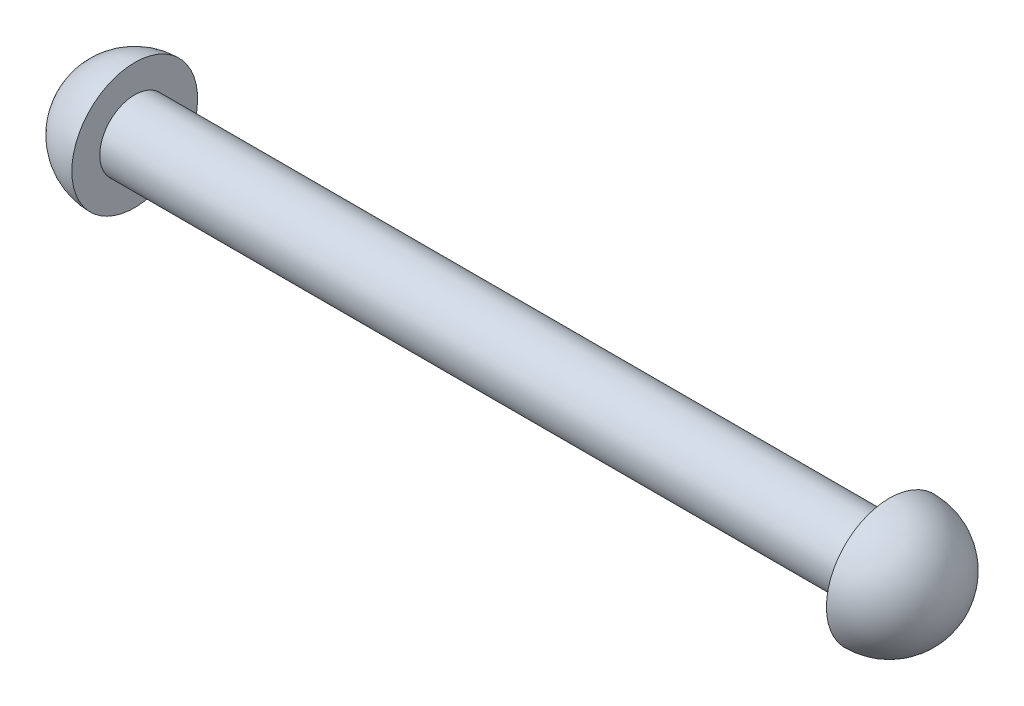
ISO-10303-21;
HEADER;
FILE_DESCRIPTION(('STEP AP214'),'2;1');
FILE_NAME('part.step','',(''),(''),'','','');
FILE_SCHEMA(('AUTOMOTIVE_DESIGN { 1 0 10303 214 1 1 1 1 }'));
ENDSEC;
DATA;
#1=APPLICATION_CONTEXT('core data for automotive mechanical design processes');
#2=APPLICATION_PROTOCOL_DEFINITION('international standard','automotive_design',2000,#1);
#3=PRODUCT_CONTEXT('',#1,'mechanical');
#4=PRODUCT('Part','Part','',(#3));
#5=PRODUCT_RELATED_PRODUCT_CATEGORY('part','',(#4));
#6=PRODUCT_DEFINITION_FORMATION('','',#4);
#7=PRODUCT_DEFINITION_CONTEXT('part definition',#1,'design');
#8=PRODUCT_DEFINITION('design','',#6,#7);
#9=PRODUCT_DEFINITION_SHAPE('','',#8);
#10=(LENGTH_UNIT() NAMED_UNIT(*) SI_UNIT(.MILLI.,.METRE.));
#11=(NAMED_UNIT(*) PLANE_ANGLE_UNIT() SI_UNIT($,.RADIAN.));
#12=(NAMED_UNIT(*) SI_UNIT($,.STERADIAN.) SOLID_ANGLE_UNIT());
#13=UNCERTAINTY_MEASURE_WITH_UNIT(LENGTH_MEASURE(1.E-05),#10,'distance_accuracy_value','');
#14=(GEOMETRIC_REPRESENTATION_CONTEXT(3) GLOBAL_UNCERTAINTY_ASSIGNED_CONTEXT((#13)) GLOBAL_UNIT_ASSIGNED_CONTEXT((#10,
#11,#12)) REPRESENTATION_CONTEXT('',''));
#15=CARTESIAN_POINT('',(0.,0.,0.));
#16=DIRECTION('',(0.,0.,1.));
#17=DIRECTION('',(1.,0.,0.));
#18=AXIS2_PLACEMENT_3D('',#15,#16,#17);
#19=CARTESIAN_POINT('',(-34.2900000000001,0.,0.));
#20=DIRECTION('',(-1.,0.,0.));
#21=DIRECTION('',(0.,0.,1.));
#22=AXIS2_PLACEMENT_3D('',#19,#20,#21);
#23=PLANE('',#22);
#24=CARTESIAN_POINT('',(-34.2900000000001,-1.5875,0.));
#25=DIRECTION('',(-1.,0.,0.));
#26=DIRECTION('',(0.,0.,1.));
#27=AXIS2_PLACEMENT_3D('',#24,#25,#26);
#28=CIRCLE('',#27,5.715);
#29=CARTESIAN_POINT('',(-34.2900000000001,-1.5875,5.715));
#30=VERTEX_POINT('',#29);
#31=EDGE_CURVE('E10',#30,#30,#28,.T.);
#32=ORIENTED_EDGE('',*,*,#31,.F.);
#33=EDGE_LOOP('',(#32));
#34=FACE_BOUND('',#33,.T.);
#35=CARTESIAN_POINT('',(-34.2900000000001,-1.5875,0.));
#36=DIRECTION('',(-1.,0.,0.));
#37=DIRECTION('',(0.,0.,1.));
#38=AXIS2_PLACEMENT_3D('',#35,#36,#37);
#39=CIRCLE('',#38,3.175);
#40=CARTESIAN_POINT('',(-34.2900000000001,-1.5875,3.175));
#41=VERTEX_POINT('',#40);
#42=EDGE_CURVE('E47',#41,#41,#39,.T.);
#43=ORIENTED_EDGE('',*,*,#42,.T.);
#44=EDGE_LOOP('',(#43));
#45=FACE_BOUND('',#44,.T.);
#46=ADVANCED_FACE('F33',(#34,#45),#23,.F.);
#47=CARTESIAN_POINT('',(-34.2900000000001,-1.5875,0.));
#48=DIRECTION('',(-1.,0.,0.));
#49=DIRECTION('',(0.,1.,0.));
#50=AXIS2_PLACEMENT_3D('',#47,#48,#49);
#51=SPHERICAL_SURFACE('',#50,5.715);
#52=ORIENTED_EDGE('',*,*,#31,.T.);
#53=EDGE_LOOP('',(#52));
#54=FACE_BOUND('',#53,.T.);
#55=ADVANCED_FACE('F65',(#54),#51,.T.);
#56=CARTESIAN_POINT('',(34.2899999999999,-1.5875,0.));
#57=DIRECTION('',(-1.,0.,0.));
#58=DIRECTION('',(0.,1.,0.));
#59=AXIS2_PLACEMENT_3D('',#56,#57,#58);
#60=SPHERICAL_SURFACE('',#59,5.715);
#61=CARTESIAN_POINT('',(34.2899999999999,-1.5875,0.));
#62=DIRECTION('',(-1.,0.,0.));
#63=DIRECTION('',(0.,0.,1.));
#64=AXIS2_PLACEMENT_3D('',#61,#62,#63);
#65=CIRCLE('',#64,5.715);
#66=CARTESIAN_POINT('',(34.2899999999999,-1.5875,5.715));
#67=VERTEX_POINT('',#66);
#68=EDGE_CURVE('E39',#67,#67,#65,.T.);
#69=ORIENTED_EDGE('',*,*,#68,.F.);
#70=EDGE_LOOP('',(#69));
#71=FACE_BOUND('',#70,.T.);
#72=ADVANCED_FACE('F62',(#71),#60,.T.);
#73=CARTESIAN_POINT('',(34.2899999999999,0.,0.));
#74=DIRECTION('',(-1.,0.,0.));
#75=DIRECTION('',(0.,0.,1.));
#76=AXIS2_PLACEMENT_3D('',#73,#74,#75);
#77=PLANE('',#76);
#78=ORIENTED_EDGE('',*,*,#68,.T.);
#79=EDGE_LOOP('',(#78));
#80=FACE_BOUND('',#79,.T.);
#81=CARTESIAN_POINT('',(34.2899999999999,-1.5875,0.));
#82=DIRECTION('',(-1.,0.,0.));
#83=DIRECTION('',(0.,0.,1.));
#84=AXIS2_PLACEMENT_3D('',#81,#82,#83);
#85=CIRCLE('',#84,3.175);
#86=CARTESIAN_POINT('',(34.2899999999999,-1.5875,3.175));
#87=VERTEX_POINT('',#86);
#88=EDGE_CURVE('E43',#87,#87,#85,.T.);
#89=ORIENTED_EDGE('',*,*,#88,.F.);
#90=EDGE_LOOP('',(#89));
#91=FACE_BOUND('',#90,.T.);
#92=ADVANCED_FACE('F56',(#80,#91),#77,.T.);
#93=CARTESIAN_POINT('',(-34.2900000000001,-1.5875,0.));
#94=DIRECTION('',(-1.,0.,0.));
#95=DIRECTION('',(0.,0.,1.));
#96=AXIS2_PLACEMENT_3D('',#93,#94,#95);
#97=CYLINDRICAL_SURFACE('',#96,3.175);
#98=ORIENTED_EDGE('',*,*,#88,.T.);
#99=EDGE_LOOP('',(#98));
#100=FACE_BOUND('',#99,.T.);
#101=ORIENTED_EDGE('',*,*,#42,.F.);
#102=EDGE_LOOP('',(#101));
#103=FACE_BOUND('',#102,.T.);
#104=ADVANCED_FACE('F54',(#100,#103),#97,.T.);
#105=CLOSED_SHELL('',(#46,#55,#72,#92,#104));
#106=MANIFOLD_SOLID_BREP('B2',#105);
#107=ADVANCED_BREP_SHAPE_REPRESENTATION('',(#18,#106),#14);
#108=SHAPE_DEFINITION_REPRESENTATION(#9,#107);
ENDSEC;
END-ISO-10303-21;
